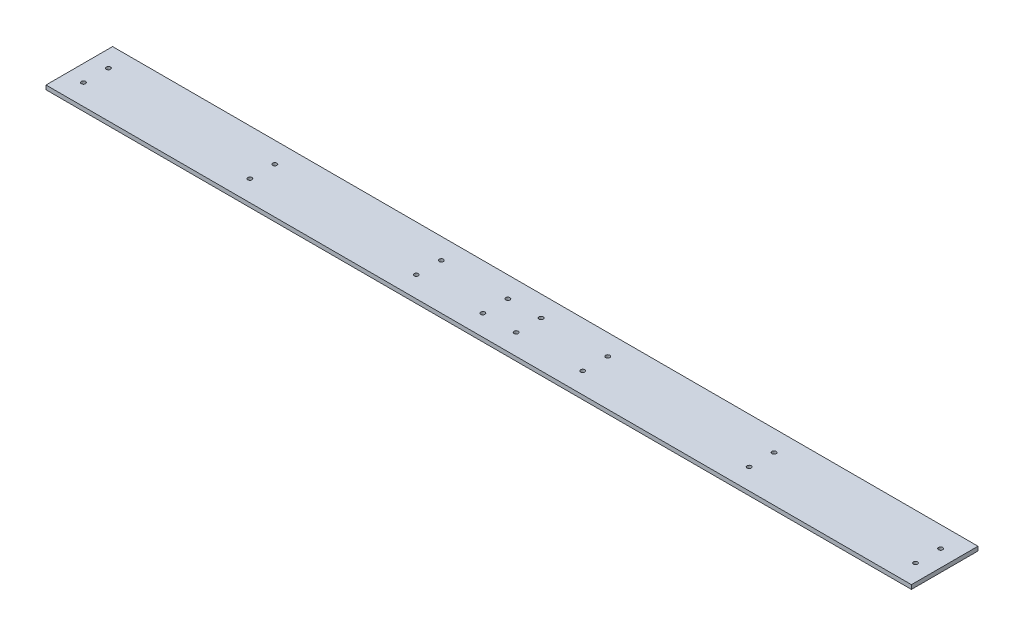
ISO-10303-21;
HEADER;
FILE_DESCRIPTION(('STEP AP214'),'2;1');
FILE_NAME('part.step','',(''),(''),'','','');
FILE_SCHEMA(('AUTOMOTIVE_DESIGN { 1 0 10303 214 1 1 1 1 }'));
ENDSEC;
DATA;
#1=APPLICATION_CONTEXT('core data for automotive mechanical design processes');
#2=APPLICATION_PROTOCOL_DEFINITION('international standard','automotive_design',2000,#1);
#3=PRODUCT_CONTEXT('',#1,'mechanical');
#4=PRODUCT('Part','Part','',(#3));
#5=PRODUCT_RELATED_PRODUCT_CATEGORY('part','',(#4));
#6=PRODUCT_DEFINITION_FORMATION('','',#4);
#7=PRODUCT_DEFINITION_CONTEXT('part definition',#1,'design');
#8=PRODUCT_DEFINITION('design','',#6,#7);
#9=PRODUCT_DEFINITION_SHAPE('','',#8);
#10=(LENGTH_UNIT() NAMED_UNIT(*) SI_UNIT(.MILLI.,.METRE.));
#11=(NAMED_UNIT(*) PLANE_ANGLE_UNIT() SI_UNIT($,.RADIAN.));
#12=(NAMED_UNIT(*) SI_UNIT($,.STERADIAN.) SOLID_ANGLE_UNIT());
#13=UNCERTAINTY_MEASURE_WITH_UNIT(LENGTH_MEASURE(1.E-05),#10,'distance_accuracy_value','');
#14=(GEOMETRIC_REPRESENTATION_CONTEXT(3) GLOBAL_UNCERTAINTY_ASSIGNED_CONTEXT((#13)) GLOBAL_UNIT_ASSIGNED_CONTEXT((#10,
#11,#12)) REPRESENTATION_CONTEXT('',''));
#15=CARTESIAN_POINT('',(0.,0.,0.));
#16=DIRECTION('',(0.,0.,1.));
#17=DIRECTION('',(1.,0.,0.));
#18=AXIS2_PLACEMENT_3D('',#15,#16,#17);
#19=CARTESIAN_POINT('',(0.,5.,0.));
#20=DIRECTION('',(0.,1.,0.));
#21=DIRECTION('',(0.,0.,1.));
#22=AXIS2_PLACEMENT_3D('',#19,#20,#21);
#23=PLANE('',#22);
#24=CARTESIAN_POINT('',(520.,5.,15.));
#25=DIRECTION('',(0.,1.,0.));
#26=DIRECTION('',(0.,0.,1.));
#27=AXIS2_PLACEMENT_3D('',#24,#25,#26);
#28=CIRCLE('',#27,2.49999999999991);
#29=CARTESIAN_POINT('',(520.,5.,17.4999999999999));
#30=VERTEX_POINT('',#29);
#31=EDGE_CURVE('E193',#30,#30,#28,.T.);
#32=ORIENTED_EDGE('',*,*,#31,.F.);
#33=EDGE_LOOP('',(#32));
#34=FACE_BOUND('',#33,.T.);
#35=CARTESIAN_POINT('',(480.,5.,-15.));
#36=DIRECTION('',(0.,1.,0.));
#37=DIRECTION('',(0.,0.,1.));
#38=AXIS2_PLACEMENT_3D('',#35,#36,#37);
#39=CIRCLE('',#38,2.50000000000002);
#40=CARTESIAN_POINT('',(480.,5.,-12.5));
#41=VERTEX_POINT('',#40);
#42=EDGE_CURVE('E181',#41,#41,#39,.T.);
#43=ORIENTED_EDGE('',*,*,#42,.F.);
#44=EDGE_LOOP('',(#43));
#45=FACE_BOUND('',#44,.T.);
#46=CARTESIAN_POINT('',(1000.,5.,-15.));
#47=DIRECTION('',(0.,1.,0.));
#48=DIRECTION('',(0.,0.,1.));
#49=AXIS2_PLACEMENT_3D('',#46,#47,#48);
#50=CIRCLE('',#49,2.49999999999991);
#51=CARTESIAN_POINT('',(1000.,5.,-12.5000000000001));
#52=VERTEX_POINT('',#51);
#53=EDGE_CURVE('E169',#52,#52,#50,.T.);
#54=ORIENTED_EDGE('',*,*,#53,.F.);
#55=EDGE_LOOP('',(#54));
#56=FACE_BOUND('',#55,.T.);
#57=CARTESIAN_POINT('',(800.,5.,-15.));
#58=DIRECTION('',(0.,1.,0.));
#59=DIRECTION('',(0.,0.,1.));
#60=AXIS2_PLACEMENT_3D('',#57,#58,#59);
#61=CIRCLE('',#60,2.49999999999991);
#62=CARTESIAN_POINT('',(800.,5.,-12.5000000000001));
#63=VERTEX_POINT('',#62);
#64=EDGE_CURVE('E157',#63,#63,#61,.T.);
#65=ORIENTED_EDGE('',*,*,#64,.F.);
#66=EDGE_LOOP('',(#65));
#67=FACE_BOUND('',#66,.T.);
#68=CARTESIAN_POINT('',(600.,5.,-15.));
#69=DIRECTION('',(0.,1.,0.));
#70=DIRECTION('',(0.,0.,1.));
#71=AXIS2_PLACEMENT_3D('',#68,#69,#70);
#72=CIRCLE('',#71,2.49999999999991);
#73=CARTESIAN_POINT('',(600.,5.,-12.5000000000001));
#74=VERTEX_POINT('',#73);
#75=EDGE_CURVE('E145',#74,#74,#72,.T.);
#76=ORIENTED_EDGE('',*,*,#75,.F.);
#77=EDGE_LOOP('',(#76));
#78=FACE_BOUND('',#77,.T.);
#79=CARTESIAN_POINT('',(400.,5.,-15.));
#80=DIRECTION('',(0.,1.,0.));
#81=DIRECTION('',(0.,0.,1.));
#82=AXIS2_PLACEMENT_3D('',#79,#80,#81);
#83=CIRCLE('',#82,2.50000000000002);
#84=CARTESIAN_POINT('',(400.,5.,-12.5));
#85=VERTEX_POINT('',#84);
#86=EDGE_CURVE('E133',#85,#85,#83,.T.);
#87=ORIENTED_EDGE('',*,*,#86,.F.);
#88=EDGE_LOOP('',(#87));
#89=FACE_BOUND('',#88,.T.);
#90=CARTESIAN_POINT('',(200.,5.,-15.));
#91=DIRECTION('',(0.,1.,0.));
#92=DIRECTION('',(0.,0.,1.));
#93=AXIS2_PLACEMENT_3D('',#90,#91,#92);
#94=CIRCLE('',#93,2.5);
#95=CARTESIAN_POINT('',(200.,5.,-12.5));
#96=VERTEX_POINT('',#95);
#97=EDGE_CURVE('E121',#96,#96,#94,.T.);
#98=ORIENTED_EDGE('',*,*,#97,.F.);
#99=EDGE_LOOP('',(#98));
#100=FACE_BOUND('',#99,.T.);
#101=CARTESIAN_POINT('',(0.,5.,-15.));
#102=DIRECTION('',(0.,1.,0.));
#103=DIRECTION('',(0.,0.,1.));
#104=AXIS2_PLACEMENT_3D('',#101,#102,#103);
#105=CIRCLE('',#104,2.5);
#106=CARTESIAN_POINT('',(0.,5.,-12.5));
#107=VERTEX_POINT('',#106);
#108=EDGE_CURVE('E100',#107,#107,#105,.T.);
#109=ORIENTED_EDGE('',*,*,#108,.F.);
#110=EDGE_LOOP('',(#109));
#111=FACE_BOUND('',#110,.T.);
#112=DIRECTION('',(-1.,0.,0.));
#113=VECTOR('',#112,1.);
#114=CARTESIAN_POINT('',(1020.,5.,-40.0000000000001));
#115=LINE('',#114,#113);
#116=CARTESIAN_POINT('',(1020.,5.,-40.0000000000001));
#117=VERTEX_POINT('',#116);
#118=CARTESIAN_POINT('',(-20.,5.,-40.));
#119=VERTEX_POINT('',#118);
#120=EDGE_CURVE('E85',#117,#119,#115,.T.);
#121=ORIENTED_EDGE('',*,*,#120,.T.);
#122=DIRECTION('',(0.,0.,1.));
#123=VECTOR('',#122,1.);
#124=CARTESIAN_POINT('',(-20.,5.,-40.));
#125=LINE('',#124,#123);
#126=CARTESIAN_POINT('',(-20.,5.,40.));
#127=VERTEX_POINT('',#126);
#128=EDGE_CURVE('E80',#119,#127,#125,.T.);
#129=ORIENTED_EDGE('',*,*,#128,.T.);
#130=DIRECTION('',(1.,0.,0.));
#131=VECTOR('',#130,1.);
#132=CARTESIAN_POINT('',(-20.,5.,40.));
#133=LINE('',#132,#131);
#134=CARTESIAN_POINT('',(1020.,5.,40.0000000000001));
#135=VERTEX_POINT('',#134);
#136=EDGE_CURVE('E83',#127,#135,#133,.T.);
#137=ORIENTED_EDGE('',*,*,#136,.T.);
#138=DIRECTION('',(0.,0.,-1.));
#139=VECTOR('',#138,1.);
#140=CARTESIAN_POINT('',(1020.,5.,40.0000000000001));
#141=LINE('',#140,#139);
#142=EDGE_CURVE('E50',#135,#117,#141,.T.);
#143=ORIENTED_EDGE('',*,*,#142,.T.);
#144=EDGE_LOOP('',(#121,#129,#137,#143));
#145=FACE_BOUND('',#144,.T.);
#146=CARTESIAN_POINT('',(0.,5.,15.));
#147=DIRECTION('',(0.,1.,0.));
#148=DIRECTION('',(0.,0.,1.));
#149=AXIS2_PLACEMENT_3D('',#146,#147,#148);
#150=CIRCLE('',#149,2.5);
#151=CARTESIAN_POINT('',(0.,5.,17.5));
#152=VERTEX_POINT('',#151);
#153=EDGE_CURVE('E115',#152,#152,#150,.T.);
#154=ORIENTED_EDGE('',*,*,#153,.F.);
#155=EDGE_LOOP('',(#154));
#156=FACE_BOUND('',#155,.T.);
#157=CARTESIAN_POINT('',(200.,5.,15.));
#158=DIRECTION('',(0.,1.,0.));
#159=DIRECTION('',(0.,0.,1.));
#160=AXIS2_PLACEMENT_3D('',#157,#158,#159);
#161=CIRCLE('',#160,2.5);
#162=CARTESIAN_POINT('',(200.,5.,17.5));
#163=VERTEX_POINT('',#162);
#164=EDGE_CURVE('E127',#163,#163,#161,.T.);
#165=ORIENTED_EDGE('',*,*,#164,.F.);
#166=EDGE_LOOP('',(#165));
#167=FACE_BOUND('',#166,.T.);
#168=CARTESIAN_POINT('',(400.,5.,15.));
#169=DIRECTION('',(0.,1.,0.));
#170=DIRECTION('',(0.,0.,1.));
#171=AXIS2_PLACEMENT_3D('',#168,#169,#170);
#172=CIRCLE('',#171,2.50000000000002);
#173=CARTESIAN_POINT('',(400.,5.,17.5));
#174=VERTEX_POINT('',#173);
#175=EDGE_CURVE('E139',#174,#174,#172,.T.);
#176=ORIENTED_EDGE('',*,*,#175,.F.);
#177=EDGE_LOOP('',(#176));
#178=FACE_BOUND('',#177,.T.);
#179=CARTESIAN_POINT('',(600.,5.,15.));
#180=DIRECTION('',(0.,1.,0.));
#181=DIRECTION('',(0.,0.,1.));
#182=AXIS2_PLACEMENT_3D('',#179,#180,#181);
#183=CIRCLE('',#182,2.49999999999991);
#184=CARTESIAN_POINT('',(600.,5.,17.4999999999999));
#185=VERTEX_POINT('',#184);
#186=EDGE_CURVE('E151',#185,#185,#183,.T.);
#187=ORIENTED_EDGE('',*,*,#186,.F.);
#188=EDGE_LOOP('',(#187));
#189=FACE_BOUND('',#188,.T.);
#190=CARTESIAN_POINT('',(800.,5.,15.));
#191=DIRECTION('',(0.,1.,0.));
#192=DIRECTION('',(0.,0.,1.));
#193=AXIS2_PLACEMENT_3D('',#190,#191,#192);
#194=CIRCLE('',#193,2.49999999999991);
#195=CARTESIAN_POINT('',(800.,5.,17.4999999999999));
#196=VERTEX_POINT('',#195);
#197=EDGE_CURVE('E163',#196,#196,#194,.T.);
#198=ORIENTED_EDGE('',*,*,#197,.F.);
#199=EDGE_LOOP('',(#198));
#200=FACE_BOUND('',#199,.T.);
#201=CARTESIAN_POINT('',(1000.,5.,15.));
#202=DIRECTION('',(0.,1.,0.));
#203=DIRECTION('',(0.,0.,1.));
#204=AXIS2_PLACEMENT_3D('',#201,#202,#203);
#205=CIRCLE('',#204,2.49999999999991);
#206=CARTESIAN_POINT('',(1000.,5.,17.4999999999999));
#207=VERTEX_POINT('',#206);
#208=EDGE_CURVE('E175',#207,#207,#205,.T.);
#209=ORIENTED_EDGE('',*,*,#208,.F.);
#210=EDGE_LOOP('',(#209));
#211=FACE_BOUND('',#210,.T.);
#212=CARTESIAN_POINT('',(520.,5.,-15.));
#213=DIRECTION('',(0.,1.,0.));
#214=DIRECTION('',(0.,0.,1.));
#215=AXIS2_PLACEMENT_3D('',#212,#213,#214);
#216=CIRCLE('',#215,2.49999999999991);
#217=CARTESIAN_POINT('',(520.,5.,-12.5000000000001));
#218=VERTEX_POINT('',#217);
#219=EDGE_CURVE('E187',#218,#218,#216,.T.);
#220=ORIENTED_EDGE('',*,*,#219,.F.);
#221=EDGE_LOOP('',(#220));
#222=FACE_BOUND('',#221,.T.);
#223=CARTESIAN_POINT('',(480.,5.,15.));
#224=DIRECTION('',(0.,1.,0.));
#225=DIRECTION('',(0.,0.,1.));
#226=AXIS2_PLACEMENT_3D('',#223,#224,#225);
#227=CIRCLE('',#226,2.50000000000002);
#228=CARTESIAN_POINT('',(480.,5.,17.5));
#229=VERTEX_POINT('',#228);
#230=EDGE_CURVE('E199',#229,#229,#227,.T.);
#231=ORIENTED_EDGE('',*,*,#230,.F.);
#232=EDGE_LOOP('',(#231));
#233=FACE_BOUND('',#232,.T.);
#234=ADVANCED_FACE('F33',(#34,#45,#56,#67,#78,#89,#100,#111,#145,#156,#167,#178,#189,#200,#211,
#222,#233),#23,.T.);
#235=CARTESIAN_POINT('',(0.,0.,0.));
#236=DIRECTION('',(0.,1.,0.));
#237=DIRECTION('',(0.,0.,1.));
#238=AXIS2_PLACEMENT_3D('',#235,#236,#237);
#239=PLANE('',#238);
#240=DIRECTION('',(-1.,0.,0.));
#241=VECTOR('',#240,1.);
#242=CARTESIAN_POINT('',(1020.,0.,-40.0000000000001));
#243=LINE('',#242,#241);
#244=CARTESIAN_POINT('',(1020.,0.,-40.0000000000001));
#245=VERTEX_POINT('',#244);
#246=CARTESIAN_POINT('',(-20.,0.,-40.));
#247=VERTEX_POINT('',#246);
#248=EDGE_CURVE('E97',#245,#247,#243,.T.);
#249=ORIENTED_EDGE('',*,*,#248,.F.);
#250=DIRECTION('',(0.,0.,-1.));
#251=VECTOR('',#250,1.);
#252=CARTESIAN_POINT('',(1020.,0.,40.0000000000001));
#253=LINE('',#252,#251);
#254=CARTESIAN_POINT('',(1020.,0.,40.0000000000001));
#255=VERTEX_POINT('',#254);
#256=EDGE_CURVE('E73',#255,#245,#253,.T.);
#257=ORIENTED_EDGE('',*,*,#256,.F.);
#258=DIRECTION('',(1.,0.,0.));
#259=VECTOR('',#258,1.);
#260=CARTESIAN_POINT('',(-20.,0.,40.));
#261=LINE('',#260,#259);
#262=CARTESIAN_POINT('',(-20.,0.,40.));
#263=VERTEX_POINT('',#262);
#264=EDGE_CURVE('E67',#263,#255,#261,.T.);
#265=ORIENTED_EDGE('',*,*,#264,.F.);
#266=DIRECTION('',(0.,0.,1.));
#267=VECTOR('',#266,1.);
#268=CARTESIAN_POINT('',(-20.,0.,-40.));
#269=LINE('',#268,#267);
#270=EDGE_CURVE('E89',#247,#263,#269,.T.);
#271=ORIENTED_EDGE('',*,*,#270,.F.);
#272=EDGE_LOOP('',(#249,#257,#265,#271));
#273=FACE_BOUND('',#272,.T.);
#274=CARTESIAN_POINT('',(0.,0.,-15.));
#275=DIRECTION('',(0.,1.,0.));
#276=DIRECTION('',(0.,0.,1.));
#277=AXIS2_PLACEMENT_3D('',#274,#275,#276);
#278=CIRCLE('',#277,2.5);
#279=CARTESIAN_POINT('',(0.,0.,-12.5));
#280=VERTEX_POINT('',#279);
#281=EDGE_CURVE('E112',#280,#280,#278,.T.);
#282=ORIENTED_EDGE('',*,*,#281,.T.);
#283=EDGE_LOOP('',(#282));
#284=FACE_BOUND('',#283,.T.);
#285=CARTESIAN_POINT('',(0.,0.,15.));
#286=DIRECTION('',(0.,1.,0.));
#287=DIRECTION('',(0.,0.,1.));
#288=AXIS2_PLACEMENT_3D('',#285,#286,#287);
#289=CIRCLE('',#288,2.5);
#290=CARTESIAN_POINT('',(0.,0.,17.5));
#291=VERTEX_POINT('',#290);
#292=EDGE_CURVE('E118',#291,#291,#289,.T.);
#293=ORIENTED_EDGE('',*,*,#292,.T.);
#294=EDGE_LOOP('',(#293));
#295=FACE_BOUND('',#294,.T.);
#296=CARTESIAN_POINT('',(200.,0.,-15.));
#297=DIRECTION('',(0.,1.,0.));
#298=DIRECTION('',(0.,0.,1.));
#299=AXIS2_PLACEMENT_3D('',#296,#297,#298);
#300=CIRCLE('',#299,2.5);
#301=CARTESIAN_POINT('',(200.,0.,-12.5));
#302=VERTEX_POINT('',#301);
#303=EDGE_CURVE('E124',#302,#302,#300,.T.);
#304=ORIENTED_EDGE('',*,*,#303,.T.);
#305=EDGE_LOOP('',(#304));
#306=FACE_BOUND('',#305,.T.);
#307=CARTESIAN_POINT('',(200.,0.,15.));
#308=DIRECTION('',(0.,1.,0.));
#309=DIRECTION('',(0.,0.,1.));
#310=AXIS2_PLACEMENT_3D('',#307,#308,#309);
#311=CIRCLE('',#310,2.5);
#312=CARTESIAN_POINT('',(200.,0.,17.5));
#313=VERTEX_POINT('',#312);
#314=EDGE_CURVE('E130',#313,#313,#311,.T.);
#315=ORIENTED_EDGE('',*,*,#314,.T.);
#316=EDGE_LOOP('',(#315));
#317=FACE_BOUND('',#316,.T.);
#318=CARTESIAN_POINT('',(400.,0.,-15.));
#319=DIRECTION('',(0.,1.,0.));
#320=DIRECTION('',(0.,0.,1.));
#321=AXIS2_PLACEMENT_3D('',#318,#319,#320);
#322=CIRCLE('',#321,2.50000000000002);
#323=CARTESIAN_POINT('',(400.,0.,-12.5));
#324=VERTEX_POINT('',#323);
#325=EDGE_CURVE('E136',#324,#324,#322,.T.);
#326=ORIENTED_EDGE('',*,*,#325,.T.);
#327=EDGE_LOOP('',(#326));
#328=FACE_BOUND('',#327,.T.);
#329=CARTESIAN_POINT('',(400.,0.,15.));
#330=DIRECTION('',(0.,1.,0.));
#331=DIRECTION('',(0.,0.,1.));
#332=AXIS2_PLACEMENT_3D('',#329,#330,#331);
#333=CIRCLE('',#332,2.50000000000002);
#334=CARTESIAN_POINT('',(400.,0.,17.5));
#335=VERTEX_POINT('',#334);
#336=EDGE_CURVE('E142',#335,#335,#333,.T.);
#337=ORIENTED_EDGE('',*,*,#336,.T.);
#338=EDGE_LOOP('',(#337));
#339=FACE_BOUND('',#338,.T.);
#340=CARTESIAN_POINT('',(600.,0.,-15.));
#341=DIRECTION('',(0.,1.,0.));
#342=DIRECTION('',(0.,0.,1.));
#343=AXIS2_PLACEMENT_3D('',#340,#341,#342);
#344=CIRCLE('',#343,2.49999999999991);
#345=CARTESIAN_POINT('',(600.,0.,-12.5000000000001));
#346=VERTEX_POINT('',#345);
#347=EDGE_CURVE('E148',#346,#346,#344,.T.);
#348=ORIENTED_EDGE('',*,*,#347,.T.);
#349=EDGE_LOOP('',(#348));
#350=FACE_BOUND('',#349,.T.);
#351=CARTESIAN_POINT('',(600.,0.,15.));
#352=DIRECTION('',(0.,1.,0.));
#353=DIRECTION('',(0.,0.,1.));
#354=AXIS2_PLACEMENT_3D('',#351,#352,#353);
#355=CIRCLE('',#354,2.49999999999991);
#356=CARTESIAN_POINT('',(600.,0.,17.4999999999999));
#357=VERTEX_POINT('',#356);
#358=EDGE_CURVE('E154',#357,#357,#355,.T.);
#359=ORIENTED_EDGE('',*,*,#358,.T.);
#360=EDGE_LOOP('',(#359));
#361=FACE_BOUND('',#360,.T.);
#362=CARTESIAN_POINT('',(800.,0.,-15.));
#363=DIRECTION('',(0.,1.,0.));
#364=DIRECTION('',(0.,0.,1.));
#365=AXIS2_PLACEMENT_3D('',#362,#363,#364);
#366=CIRCLE('',#365,2.49999999999991);
#367=CARTESIAN_POINT('',(800.,0.,-12.5000000000001));
#368=VERTEX_POINT('',#367);
#369=EDGE_CURVE('E160',#368,#368,#366,.T.);
#370=ORIENTED_EDGE('',*,*,#369,.T.);
#371=EDGE_LOOP('',(#370));
#372=FACE_BOUND('',#371,.T.);
#373=CARTESIAN_POINT('',(800.,0.,15.));
#374=DIRECTION('',(0.,1.,0.));
#375=DIRECTION('',(0.,0.,1.));
#376=AXIS2_PLACEMENT_3D('',#373,#374,#375);
#377=CIRCLE('',#376,2.49999999999991);
#378=CARTESIAN_POINT('',(800.,0.,17.4999999999999));
#379=VERTEX_POINT('',#378);
#380=EDGE_CURVE('E166',#379,#379,#377,.T.);
#381=ORIENTED_EDGE('',*,*,#380,.T.);
#382=EDGE_LOOP('',(#381));
#383=FACE_BOUND('',#382,.T.);
#384=CARTESIAN_POINT('',(1000.,0.,-15.));
#385=DIRECTION('',(0.,1.,0.));
#386=DIRECTION('',(0.,0.,1.));
#387=AXIS2_PLACEMENT_3D('',#384,#385,#386);
#388=CIRCLE('',#387,2.49999999999991);
#389=CARTESIAN_POINT('',(1000.,0.,-12.5000000000001));
#390=VERTEX_POINT('',#389);
#391=EDGE_CURVE('E172',#390,#390,#388,.T.);
#392=ORIENTED_EDGE('',*,*,#391,.T.);
#393=EDGE_LOOP('',(#392));
#394=FACE_BOUND('',#393,.T.);
#395=CARTESIAN_POINT('',(1000.,0.,15.));
#396=DIRECTION('',(0.,1.,0.));
#397=DIRECTION('',(0.,0.,1.));
#398=AXIS2_PLACEMENT_3D('',#395,#396,#397);
#399=CIRCLE('',#398,2.49999999999991);
#400=CARTESIAN_POINT('',(1000.,0.,17.4999999999999));
#401=VERTEX_POINT('',#400);
#402=EDGE_CURVE('E178',#401,#401,#399,.T.);
#403=ORIENTED_EDGE('',*,*,#402,.T.);
#404=EDGE_LOOP('',(#403));
#405=FACE_BOUND('',#404,.T.);
#406=CARTESIAN_POINT('',(480.,0.,-15.));
#407=DIRECTION('',(0.,1.,0.));
#408=DIRECTION('',(0.,0.,1.));
#409=AXIS2_PLACEMENT_3D('',#406,#407,#408);
#410=CIRCLE('',#409,2.50000000000002);
#411=CARTESIAN_POINT('',(480.,0.,-12.5));
#412=VERTEX_POINT('',#411);
#413=EDGE_CURVE('E184',#412,#412,#410,.T.);
#414=ORIENTED_EDGE('',*,*,#413,.T.);
#415=EDGE_LOOP('',(#414));
#416=FACE_BOUND('',#415,.T.);
#417=CARTESIAN_POINT('',(520.,0.,-15.));
#418=DIRECTION('',(0.,1.,0.));
#419=DIRECTION('',(0.,0.,1.));
#420=AXIS2_PLACEMENT_3D('',#417,#418,#419);
#421=CIRCLE('',#420,2.49999999999991);
#422=CARTESIAN_POINT('',(520.,0.,-12.5000000000001));
#423=VERTEX_POINT('',#422);
#424=EDGE_CURVE('E190',#423,#423,#421,.T.);
#425=ORIENTED_EDGE('',*,*,#424,.T.);
#426=EDGE_LOOP('',(#425));
#427=FACE_BOUND('',#426,.T.);
#428=CARTESIAN_POINT('',(520.,0.,15.));
#429=DIRECTION('',(0.,1.,0.));
#430=DIRECTION('',(0.,0.,1.));
#431=AXIS2_PLACEMENT_3D('',#428,#429,#430);
#432=CIRCLE('',#431,2.49999999999991);
#433=CARTESIAN_POINT('',(520.,0.,17.4999999999999));
#434=VERTEX_POINT('',#433);
#435=EDGE_CURVE('E196',#434,#434,#432,.T.);
#436=ORIENTED_EDGE('',*,*,#435,.T.);
#437=EDGE_LOOP('',(#436));
#438=FACE_BOUND('',#437,.T.);
#439=CARTESIAN_POINT('',(480.,0.,15.));
#440=DIRECTION('',(0.,1.,0.));
#441=DIRECTION('',(0.,0.,1.));
#442=AXIS2_PLACEMENT_3D('',#439,#440,#441);
#443=CIRCLE('',#442,2.50000000000002);
#444=CARTESIAN_POINT('',(480.,0.,17.5));
#445=VERTEX_POINT('',#444);
#446=EDGE_CURVE('E202',#445,#445,#443,.T.);
#447=ORIENTED_EDGE('',*,*,#446,.T.);
#448=EDGE_LOOP('',(#447));
#449=FACE_BOUND('',#448,.T.);
#450=ADVANCED_FACE('F108',(#273,#284,#295,#306,#317,#328,#339,#350,#361,#372,#383,#394,#405,
#416,#427,#438,#449),#239,.F.);
#451=CARTESIAN_POINT('',(1020.,5.,-40.0000000000001));
#452=DIRECTION('',(0.,0.,1.));
#453=DIRECTION('',(1.,0.,0.));
#454=AXIS2_PLACEMENT_3D('',#451,#452,#453);
#455=PLANE('',#454);
#456=ORIENTED_EDGE('',*,*,#248,.T.);
#457=DIRECTION('',(0.,-1.,0.));
#458=VECTOR('',#457,1.);
#459=CARTESIAN_POINT('',(-20.,5.,-40.));
#460=LINE('',#459,#458);
#461=EDGE_CURVE('E11',#119,#247,#460,.T.);
#462=ORIENTED_EDGE('',*,*,#461,.F.);
#463=ORIENTED_EDGE('',*,*,#120,.F.);
#464=DIRECTION('',(0.,-1.,0.));
#465=VECTOR('',#464,1.);
#466=CARTESIAN_POINT('',(1020.,5.,-40.0000000000001));
#467=LINE('',#466,#465);
#468=EDGE_CURVE('E93',#117,#245,#467,.T.);
#469=ORIENTED_EDGE('',*,*,#468,.T.);
#470=EDGE_LOOP('',(#456,#462,#463,#469));
#471=FACE_BOUND('',#470,.T.);
#472=ADVANCED_FACE('F35',(#471),#455,.F.);
#473=CARTESIAN_POINT('',(-20.,5.,-40.));
#474=DIRECTION('',(1.,0.,0.));
#475=DIRECTION('',(0.,0.,-1.));
#476=AXIS2_PLACEMENT_3D('',#473,#474,#475);
#477=PLANE('',#476);
#478=ORIENTED_EDGE('',*,*,#270,.T.);
#479=DIRECTION('',(0.,-1.,0.));
#480=VECTOR('',#479,1.);
#481=CARTESIAN_POINT('',(-20.,5.,40.));
#482=LINE('',#481,#480);
#483=EDGE_CURVE('E42',#127,#263,#482,.T.);
#484=ORIENTED_EDGE('',*,*,#483,.F.);
#485=ORIENTED_EDGE('',*,*,#128,.F.);
#486=ORIENTED_EDGE('',*,*,#461,.T.);
#487=EDGE_LOOP('',(#478,#484,#485,#486));
#488=FACE_BOUND('',#487,.T.);
#489=ADVANCED_FACE('F88',(#488),#477,.F.);
#490=CARTESIAN_POINT('',(-20.,5.,40.));
#491=DIRECTION('',(0.,0.,-1.));
#492=DIRECTION('',(-1.,0.,0.));
#493=AXIS2_PLACEMENT_3D('',#490,#491,#492);
#494=PLANE('',#493);
#495=ORIENTED_EDGE('',*,*,#264,.T.);
#496=DIRECTION('',(0.,-1.,0.));
#497=VECTOR('',#496,1.);
#498=CARTESIAN_POINT('',(1020.,5.,40.0000000000001));
#499=LINE('',#498,#497);
#500=EDGE_CURVE('E90',#135,#255,#499,.T.);
#501=ORIENTED_EDGE('',*,*,#500,.F.);
#502=ORIENTED_EDGE('',*,*,#136,.F.);
#503=ORIENTED_EDGE('',*,*,#483,.T.);
#504=EDGE_LOOP('',(#495,#501,#502,#503));
#505=FACE_BOUND('',#504,.T.);
#506=ADVANCED_FACE('F91',(#505),#494,.F.);
#507=CARTESIAN_POINT('',(1020.,5.,40.0000000000001));
#508=DIRECTION('',(-1.,0.,0.));
#509=DIRECTION('',(0.,0.,1.));
#510=AXIS2_PLACEMENT_3D('',#507,#508,#509);
#511=PLANE('',#510);
#512=ORIENTED_EDGE('',*,*,#256,.T.);
#513=ORIENTED_EDGE('',*,*,#468,.F.);
#514=ORIENTED_EDGE('',*,*,#142,.F.);
#515=ORIENTED_EDGE('',*,*,#500,.T.);
#516=EDGE_LOOP('',(#512,#513,#514,#515));
#517=FACE_BOUND('',#516,.T.);
#518=ADVANCED_FACE('F105',(#517),#511,.F.);
#519=CARTESIAN_POINT('',(0.,5.,-15.));
#520=DIRECTION('',(0.,-1.,0.));
#521=DIRECTION('',(0.,0.,-1.));
#522=AXIS2_PLACEMENT_3D('',#519,#520,#521);
#523=CYLINDRICAL_SURFACE('',#522,2.5);
#524=ORIENTED_EDGE('',*,*,#108,.T.);
#525=EDGE_LOOP('',(#524));
#526=FACE_BOUND('',#525,.T.);
#527=ORIENTED_EDGE('',*,*,#281,.F.);
#528=EDGE_LOOP('',(#527));
#529=FACE_BOUND('',#528,.T.);
#530=ADVANCED_FACE('F221',(#526,#529),#523,.F.);
#531=CARTESIAN_POINT('',(0.,5.,15.));
#532=DIRECTION('',(0.,-1.,0.));
#533=DIRECTION('',(0.,0.,-1.));
#534=AXIS2_PLACEMENT_3D('',#531,#532,#533);
#535=CYLINDRICAL_SURFACE('',#534,2.5);
#536=ORIENTED_EDGE('',*,*,#153,.T.);
#537=EDGE_LOOP('',(#536));
#538=FACE_BOUND('',#537,.T.);
#539=ORIENTED_EDGE('',*,*,#292,.F.);
#540=EDGE_LOOP('',(#539));
#541=FACE_BOUND('',#540,.T.);
#542=ADVANCED_FACE('F267',(#538,#541),#535,.F.);
#543=CARTESIAN_POINT('',(200.,5.,-15.));
#544=DIRECTION('',(0.,-1.,0.));
#545=DIRECTION('',(0.,0.,-1.));
#546=AXIS2_PLACEMENT_3D('',#543,#544,#545);
#547=CYLINDRICAL_SURFACE('',#546,2.5);
#548=ORIENTED_EDGE('',*,*,#97,.T.);
#549=EDGE_LOOP('',(#548));
#550=FACE_BOUND('',#549,.T.);
#551=ORIENTED_EDGE('',*,*,#303,.F.);
#552=EDGE_LOOP('',(#551));
#553=FACE_BOUND('',#552,.T.);
#554=ADVANCED_FACE('F275',(#550,#553),#547,.F.);
#555=CARTESIAN_POINT('',(200.,5.,15.));
#556=DIRECTION('',(0.,-1.,0.));
#557=DIRECTION('',(0.,0.,-1.));
#558=AXIS2_PLACEMENT_3D('',#555,#556,#557);
#559=CYLINDRICAL_SURFACE('',#558,2.5);
#560=ORIENTED_EDGE('',*,*,#164,.T.);
#561=EDGE_LOOP('',(#560));
#562=FACE_BOUND('',#561,.T.);
#563=ORIENTED_EDGE('',*,*,#314,.F.);
#564=EDGE_LOOP('',(#563));
#565=FACE_BOUND('',#564,.T.);
#566=ADVANCED_FACE('F283',(#562,#565),#559,.F.);
#567=CARTESIAN_POINT('',(400.,5.,-15.));
#568=DIRECTION('',(0.,-1.,0.));
#569=DIRECTION('',(0.,0.,-1.));
#570=AXIS2_PLACEMENT_3D('',#567,#568,#569);
#571=CYLINDRICAL_SURFACE('',#570,2.50000000000002);
#572=ORIENTED_EDGE('',*,*,#86,.T.);
#573=EDGE_LOOP('',(#572));
#574=FACE_BOUND('',#573,.T.);
#575=ORIENTED_EDGE('',*,*,#325,.F.);
#576=EDGE_LOOP('',(#575));
#577=FACE_BOUND('',#576,.T.);
#578=ADVANCED_FACE('F292',(#574,#577),#571,.F.);
#579=CARTESIAN_POINT('',(400.,5.,15.));
#580=DIRECTION('',(0.,-1.,0.));
#581=DIRECTION('',(0.,0.,-1.));
#582=AXIS2_PLACEMENT_3D('',#579,#580,#581);
#583=CYLINDRICAL_SURFACE('',#582,2.50000000000002);
#584=ORIENTED_EDGE('',*,*,#175,.T.);
#585=EDGE_LOOP('',(#584));
#586=FACE_BOUND('',#585,.T.);
#587=ORIENTED_EDGE('',*,*,#336,.F.);
#588=EDGE_LOOP('',(#587));
#589=FACE_BOUND('',#588,.T.);
#590=ADVANCED_FACE('F301',(#586,#589),#583,.F.);
#591=CARTESIAN_POINT('',(600.,5.,-15.));
#592=DIRECTION('',(0.,-1.,0.));
#593=DIRECTION('',(0.,0.,-1.));
#594=AXIS2_PLACEMENT_3D('',#591,#592,#593);
#595=CYLINDRICAL_SURFACE('',#594,2.49999999999991);
#596=ORIENTED_EDGE('',*,*,#75,.T.);
#597=EDGE_LOOP('',(#596));
#598=FACE_BOUND('',#597,.T.);
#599=ORIENTED_EDGE('',*,*,#347,.F.);
#600=EDGE_LOOP('',(#599));
#601=FACE_BOUND('',#600,.T.);
#602=ADVANCED_FACE('F310',(#598,#601),#595,.F.);
#603=CARTESIAN_POINT('',(600.,5.,15.));
#604=DIRECTION('',(0.,-1.,0.));
#605=DIRECTION('',(0.,0.,-1.));
#606=AXIS2_PLACEMENT_3D('',#603,#604,#605);
#607=CYLINDRICAL_SURFACE('',#606,2.49999999999991);
#608=ORIENTED_EDGE('',*,*,#186,.T.);
#609=EDGE_LOOP('',(#608));
#610=FACE_BOUND('',#609,.T.);
#611=ORIENTED_EDGE('',*,*,#358,.F.);
#612=EDGE_LOOP('',(#611));
#613=FACE_BOUND('',#612,.T.);
#614=ADVANCED_FACE('F319',(#610,#613),#607,.F.);
#615=CARTESIAN_POINT('',(800.,5.,-15.));
#616=DIRECTION('',(0.,-1.,0.));
#617=DIRECTION('',(0.,0.,-1.));
#618=AXIS2_PLACEMENT_3D('',#615,#616,#617);
#619=CYLINDRICAL_SURFACE('',#618,2.49999999999991);
#620=ORIENTED_EDGE('',*,*,#64,.T.);
#621=EDGE_LOOP('',(#620));
#622=FACE_BOUND('',#621,.T.);
#623=ORIENTED_EDGE('',*,*,#369,.F.);
#624=EDGE_LOOP('',(#623));
#625=FACE_BOUND('',#624,.T.);
#626=ADVANCED_FACE('F328',(#622,#625),#619,.F.);
#627=CARTESIAN_POINT('',(800.,5.,15.));
#628=DIRECTION('',(0.,-1.,0.));
#629=DIRECTION('',(0.,0.,-1.));
#630=AXIS2_PLACEMENT_3D('',#627,#628,#629);
#631=CYLINDRICAL_SURFACE('',#630,2.49999999999991);
#632=ORIENTED_EDGE('',*,*,#197,.T.);
#633=EDGE_LOOP('',(#632));
#634=FACE_BOUND('',#633,.T.);
#635=ORIENTED_EDGE('',*,*,#380,.F.);
#636=EDGE_LOOP('',(#635));
#637=FACE_BOUND('',#636,.T.);
#638=ADVANCED_FACE('F337',(#634,#637),#631,.F.);
#639=CARTESIAN_POINT('',(1000.,5.,-15.));
#640=DIRECTION('',(0.,-1.,0.));
#641=DIRECTION('',(0.,0.,-1.));
#642=AXIS2_PLACEMENT_3D('',#639,#640,#641);
#643=CYLINDRICAL_SURFACE('',#642,2.49999999999991);
#644=ORIENTED_EDGE('',*,*,#53,.T.);
#645=EDGE_LOOP('',(#644));
#646=FACE_BOUND('',#645,.T.);
#647=ORIENTED_EDGE('',*,*,#391,.F.);
#648=EDGE_LOOP('',(#647));
#649=FACE_BOUND('',#648,.T.);
#650=ADVANCED_FACE('F346',(#646,#649),#643,.F.);
#651=CARTESIAN_POINT('',(1000.,5.,15.));
#652=DIRECTION('',(0.,-1.,0.));
#653=DIRECTION('',(0.,0.,-1.));
#654=AXIS2_PLACEMENT_3D('',#651,#652,#653);
#655=CYLINDRICAL_SURFACE('',#654,2.49999999999991);
#656=ORIENTED_EDGE('',*,*,#208,.T.);
#657=EDGE_LOOP('',(#656));
#658=FACE_BOUND('',#657,.T.);
#659=ORIENTED_EDGE('',*,*,#402,.F.);
#660=EDGE_LOOP('',(#659));
#661=FACE_BOUND('',#660,.T.);
#662=ADVANCED_FACE('F355',(#658,#661),#655,.F.);
#663=CARTESIAN_POINT('',(480.,5.,-15.));
#664=DIRECTION('',(0.,-1.,0.));
#665=DIRECTION('',(0.,0.,-1.));
#666=AXIS2_PLACEMENT_3D('',#663,#664,#665);
#667=CYLINDRICAL_SURFACE('',#666,2.50000000000002);
#668=ORIENTED_EDGE('',*,*,#42,.T.);
#669=EDGE_LOOP('',(#668));
#670=FACE_BOUND('',#669,.T.);
#671=ORIENTED_EDGE('',*,*,#413,.F.);
#672=EDGE_LOOP('',(#671));
#673=FACE_BOUND('',#672,.T.);
#674=ADVANCED_FACE('F364',(#670,#673),#667,.F.);
#675=CARTESIAN_POINT('',(520.,5.,-15.));
#676=DIRECTION('',(0.,-1.,0.));
#677=DIRECTION('',(0.,0.,-1.));
#678=AXIS2_PLACEMENT_3D('',#675,#676,#677);
#679=CYLINDRICAL_SURFACE('',#678,2.49999999999991);
#680=ORIENTED_EDGE('',*,*,#219,.T.);
#681=EDGE_LOOP('',(#680));
#682=FACE_BOUND('',#681,.T.);
#683=ORIENTED_EDGE('',*,*,#424,.F.);
#684=EDGE_LOOP('',(#683));
#685=FACE_BOUND('',#684,.T.);
#686=ADVANCED_FACE('F373',(#682,#685),#679,.F.);
#687=CARTESIAN_POINT('',(520.,5.,15.));
#688=DIRECTION('',(0.,-1.,0.));
#689=DIRECTION('',(0.,0.,-1.));
#690=AXIS2_PLACEMENT_3D('',#687,#688,#689);
#691=CYLINDRICAL_SURFACE('',#690,2.49999999999991);
#692=ORIENTED_EDGE('',*,*,#31,.T.);
#693=EDGE_LOOP('',(#692));
#694=FACE_BOUND('',#693,.T.);
#695=ORIENTED_EDGE('',*,*,#435,.F.);
#696=EDGE_LOOP('',(#695));
#697=FACE_BOUND('',#696,.T.);
#698=ADVANCED_FACE('F382',(#694,#697),#691,.F.);
#699=CARTESIAN_POINT('',(480.,5.,15.));
#700=DIRECTION('',(0.,-1.,0.));
#701=DIRECTION('',(0.,0.,-1.));
#702=AXIS2_PLACEMENT_3D('',#699,#700,#701);
#703=CYLINDRICAL_SURFACE('',#702,2.50000000000002);
#704=ORIENTED_EDGE('',*,*,#230,.T.);
#705=EDGE_LOOP('',(#704));
#706=FACE_BOUND('',#705,.T.);
#707=ORIENTED_EDGE('',*,*,#446,.F.);
#708=EDGE_LOOP('',(#707));
#709=FACE_BOUND('',#708,.T.);
#710=ADVANCED_FACE('F208',(#706,#709),#703,.F.);
#711=CLOSED_SHELL('',(#234,#450,#472,#489,#506,#518,#530,#542,#554,#566,#578,#590,#602,#614,
#626,#638,#650,#662,#674,#686,#698,#710));
#712=MANIFOLD_SOLID_BREP('B2',#711);
#713=ADVANCED_BREP_SHAPE_REPRESENTATION('',(#18,#712),#14);
#714=SHAPE_DEFINITION_REPRESENTATION(#9,#713);
ENDSEC;
END-ISO-10303-21;
